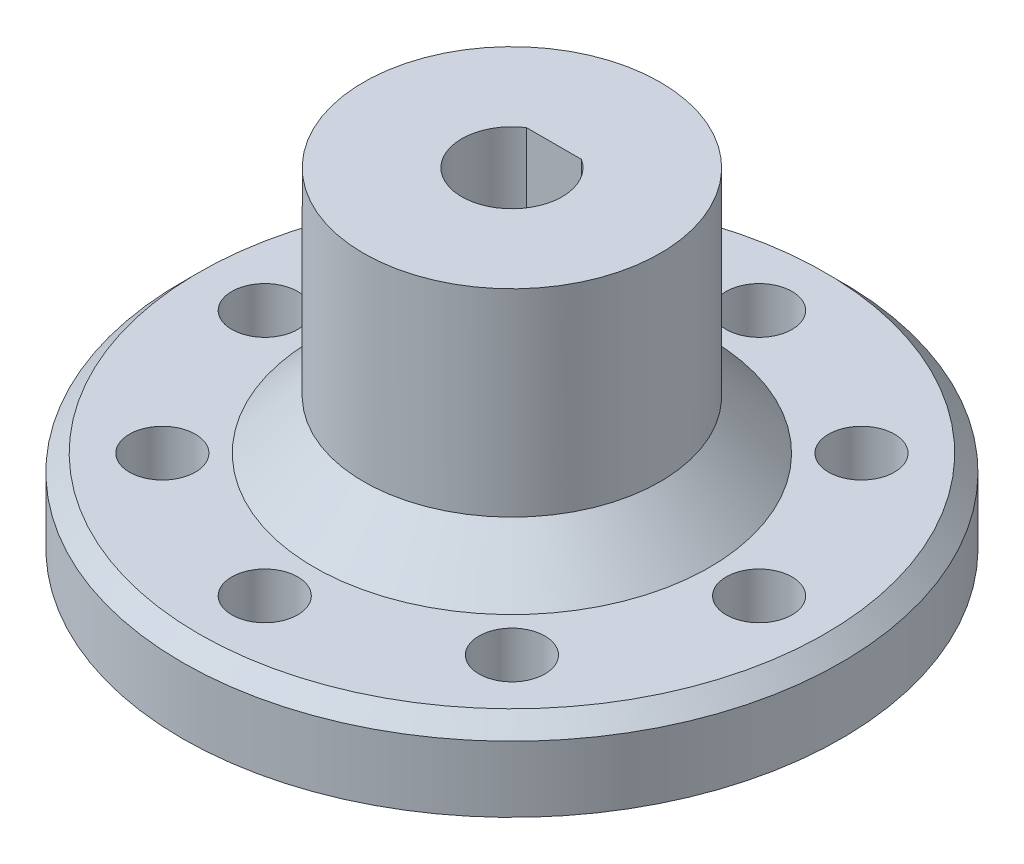
ISO-10303-21;
HEADER;
FILE_DESCRIPTION(('STEP AP214'),'2;1');
FILE_NAME('part.step','',(''),(''),'','','');
FILE_SCHEMA(('AUTOMOTIVE_DESIGN { 1 0 10303 214 1 1 1 1 }'));
ENDSEC;
DATA;
#1=APPLICATION_CONTEXT('core data for automotive mechanical design processes');
#2=APPLICATION_PROTOCOL_DEFINITION('international standard','automotive_design',2000,#1);
#3=PRODUCT_CONTEXT('',#1,'mechanical');
#4=PRODUCT('Part','Part','',(#3));
#5=PRODUCT_RELATED_PRODUCT_CATEGORY('part','',(#4));
#6=PRODUCT_DEFINITION_FORMATION('','',#4);
#7=PRODUCT_DEFINITION_CONTEXT('part definition',#1,'design');
#8=PRODUCT_DEFINITION('design','',#6,#7);
#9=PRODUCT_DEFINITION_SHAPE('','',#8);
#10=(LENGTH_UNIT() NAMED_UNIT(*) SI_UNIT(.MILLI.,.METRE.));
#11=(NAMED_UNIT(*) PLANE_ANGLE_UNIT() SI_UNIT($,.RADIAN.));
#12=(NAMED_UNIT(*) SI_UNIT($,.STERADIAN.) SOLID_ANGLE_UNIT());
#13=UNCERTAINTY_MEASURE_WITH_UNIT(LENGTH_MEASURE(1.E-05),#10,'distance_accuracy_value','');
#14=(GEOMETRIC_REPRESENTATION_CONTEXT(3) GLOBAL_UNCERTAINTY_ASSIGNED_CONTEXT((#13)) GLOBAL_UNIT_ASSIGNED_CONTEXT((#10,
#11,#12)) REPRESENTATION_CONTEXT('',''));
#15=CARTESIAN_POINT('',(0.,0.,0.));
#16=DIRECTION('',(0.,0.,1.));
#17=DIRECTION('',(1.,0.,0.));
#18=AXIS2_PLACEMENT_3D('',#15,#16,#17);
#19=CARTESIAN_POINT('',(0.,0.,-2.55));
#20=DIRECTION('',(0.,0.,1.));
#21=DIRECTION('',(1.,0.,0.));
#22=AXIS2_PLACEMENT_3D('',#19,#20,#21);
#23=PLANE('',#22);
#24=CARTESIAN_POINT('',(0.,14.,-2.55));
#25=DIRECTION('',(0.,0.,1.));
#26=DIRECTION('',(1.,0.,0.));
#27=AXIS2_PLACEMENT_3D('',#24,#25,#26);
#28=CIRCLE('',#27,1.75);
#29=CARTESIAN_POINT('',(-1.67332005306815,14.512347538298,-2.55));
#30=VERTEX_POINT('',#29);
#31=CARTESIAN_POINT('',(1.67332005306815,14.512347538298,-2.55));
#32=VERTEX_POINT('',#31);
#33=EDGE_CURVE('E150',#30,#32,#28,.F.);
#34=ORIENTED_EDGE('',*,*,#33,.T.);
#35=DIRECTION('',(0.,1.,0.));
#36=VECTOR('',#35,1.);
#37=CARTESIAN_POINT('',(1.67332005306815,0.,-2.55));
#38=LINE('',#37,#36);
#39=CARTESIAN_POINT('',(1.67332005306815,20.,-2.55));
#40=VERTEX_POINT('',#39);
#41=EDGE_CURVE('E161',#32,#40,#38,.T.);
#42=ORIENTED_EDGE('',*,*,#41,.T.);
#43=DIRECTION('',(1.,0.,0.));
#44=VECTOR('',#43,1.);
#45=CARTESIAN_POINT('',(0.,20.,-2.55));
#46=LINE('',#45,#44);
#47=CARTESIAN_POINT('',(-1.67332005306815,20.,-2.55));
#48=VERTEX_POINT('',#47);
#49=EDGE_CURVE('E287',#48,#40,#46,.T.);
#50=ORIENTED_EDGE('',*,*,#49,.F.);
#51=DIRECTION('',(0.,1.,0.));
#52=VECTOR('',#51,1.);
#53=CARTESIAN_POINT('',(-1.67332005306815,0.,-2.55));
#54=LINE('',#53,#52);
#55=EDGE_CURVE('E163',#30,#48,#54,.T.);
#56=ORIENTED_EDGE('',*,*,#55,.F.);
#57=EDGE_LOOP('',(#34,#42,#50,#56));
#58=FACE_BOUND('',#57,.T.);
#59=ADVANCED_FACE('F71',(#58),#23,.T.);
#60=CARTESIAN_POINT('',(0.,5.,0.));
#61=DIRECTION('',(0.,-1.,0.));
#62=DIRECTION('',(0.,0.,-1.));
#63=AXIS2_PLACEMENT_3D('',#60,#61,#62);
#64=CYLINDRICAL_SURFACE('',#63,20.);
#65=CARTESIAN_POINT('',(0.,4.00000000000001,0.));
#66=DIRECTION('',(0.,1.,0.));
#67=DIRECTION('',(0.,0.,1.));
#68=AXIS2_PLACEMENT_3D('',#65,#66,#67);
#69=CIRCLE('',#68,20.);
#70=CARTESIAN_POINT('',(0.,4.00000000000001,20.));
#71=VERTEX_POINT('',#70);
#72=EDGE_CURVE('E242',#71,#71,#69,.F.);
#73=ORIENTED_EDGE('',*,*,#72,.T.);
#74=EDGE_LOOP('',(#73));
#75=FACE_BOUND('',#74,.T.);
#76=CARTESIAN_POINT('',(0.,0.,0.));
#77=DIRECTION('',(0.,1.,0.));
#78=DIRECTION('',(0.,0.,1.));
#79=AXIS2_PLACEMENT_3D('',#76,#77,#78);
#80=CIRCLE('',#79,20.);
#81=CARTESIAN_POINT('',(0.,0.,20.));
#82=VERTEX_POINT('',#81);
#83=EDGE_CURVE('E186',#82,#82,#80,.T.);
#84=ORIENTED_EDGE('',*,*,#83,.T.);
#85=EDGE_LOOP('',(#84));
#86=FACE_BOUND('',#85,.T.);
#87=ADVANCED_FACE('F306',(#75,#86),#64,.T.);
#88=CARTESIAN_POINT('',(0.,5.,0.));
#89=DIRECTION('',(0.,1.,0.));
#90=DIRECTION('',(0.,0.,1.));
#91=AXIS2_PLACEMENT_3D('',#88,#89,#90);
#92=PLANE('',#91);
#93=CARTESIAN_POINT('',(0.,5.,0.));
#94=DIRECTION('',(0.,1.,0.));
#95=DIRECTION('',(0.,0.,1.));
#96=AXIS2_PLACEMENT_3D('',#93,#94,#95);
#97=CIRCLE('',#96,19.);
#98=CARTESIAN_POINT('',(0.,5.,19.));
#99=VERTEX_POINT('',#98);
#100=EDGE_CURVE('E239',#99,#99,#97,.T.);
#101=ORIENTED_EDGE('',*,*,#100,.T.);
#102=EDGE_LOOP('',(#101));
#103=FACE_BOUND('',#102,.T.);
#104=CARTESIAN_POINT('',(0.,5.,0.));
#105=DIRECTION('',(0.,1.,0.));
#106=DIRECTION('',(0.,0.,1.));
#107=AXIS2_PLACEMENT_3D('',#104,#105,#106);
#108=CIRCLE('',#107,12.);
#109=CARTESIAN_POINT('',(0.,5.,-12.));
#110=VERTEX_POINT('',#109);
#111=EDGE_CURVE('E236',#110,#110,#108,.F.);
#112=ORIENTED_EDGE('',*,*,#111,.T.);
#113=EDGE_LOOP('',(#112));
#114=FACE_BOUND('',#113,.T.);
#115=CARTESIAN_POINT('',(0.,5.,-15.));
#116=DIRECTION('',(0.,1.,0.));
#117=DIRECTION('',(0.,0.,1.));
#118=AXIS2_PLACEMENT_3D('',#115,#116,#117);
#119=CIRCLE('',#118,2.);
#120=CARTESIAN_POINT('',(0.,5.,-13.));
#121=VERTEX_POINT('',#120);
#122=EDGE_CURVE('E187',#121,#121,#119,.T.);
#123=ORIENTED_EDGE('',*,*,#122,.F.);
#124=EDGE_LOOP('',(#123));
#125=FACE_BOUND('',#124,.T.);
#126=CARTESIAN_POINT('',(10.6066017177982,5.,-10.6066017177982));
#127=DIRECTION('',(0.,1.,0.));
#128=DIRECTION('',(0.,0.,1.));
#129=AXIS2_PLACEMENT_3D('',#126,#127,#128);
#130=CIRCLE('',#129,2.);
#131=CARTESIAN_POINT('',(10.6066017177982,5.,-8.60660171779821));
#132=VERTEX_POINT('',#131);
#133=EDGE_CURVE('E193',#132,#132,#130,.T.);
#134=ORIENTED_EDGE('',*,*,#133,.F.);
#135=EDGE_LOOP('',(#134));
#136=FACE_BOUND('',#135,.T.);
#137=CARTESIAN_POINT('',(15.,5.,0.));
#138=DIRECTION('',(0.,1.,0.));
#139=DIRECTION('',(0.,0.,1.));
#140=AXIS2_PLACEMENT_3D('',#137,#138,#139);
#141=CIRCLE('',#140,2.);
#142=CARTESIAN_POINT('',(15.,5.,2.));
#143=VERTEX_POINT('',#142);
#144=EDGE_CURVE('E199',#143,#143,#141,.T.);
#145=ORIENTED_EDGE('',*,*,#144,.F.);
#146=EDGE_LOOP('',(#145));
#147=FACE_BOUND('',#146,.T.);
#148=CARTESIAN_POINT('',(10.6066017177982,5.,10.6066017177982));
#149=DIRECTION('',(0.,1.,0.));
#150=DIRECTION('',(0.,0.,1.));
#151=AXIS2_PLACEMENT_3D('',#148,#149,#150);
#152=CIRCLE('',#151,2.);
#153=CARTESIAN_POINT('',(10.6066017177982,5.,12.6066017177982));
#154=VERTEX_POINT('',#153);
#155=EDGE_CURVE('E205',#154,#154,#152,.T.);
#156=ORIENTED_EDGE('',*,*,#155,.F.);
#157=EDGE_LOOP('',(#156));
#158=FACE_BOUND('',#157,.T.);
#159=CARTESIAN_POINT('',(0.,5.,15.));
#160=DIRECTION('',(0.,1.,0.));
#161=DIRECTION('',(0.,0.,1.));
#162=AXIS2_PLACEMENT_3D('',#159,#160,#161);
#163=CIRCLE('',#162,2.);
#164=CARTESIAN_POINT('',(0.,5.,17.));
#165=VERTEX_POINT('',#164);
#166=EDGE_CURVE('E211',#165,#165,#163,.T.);
#167=ORIENTED_EDGE('',*,*,#166,.F.);
#168=EDGE_LOOP('',(#167));
#169=FACE_BOUND('',#168,.T.);
#170=CARTESIAN_POINT('',(-10.6066017177982,5.,10.6066017177982));
#171=DIRECTION('',(0.,1.,0.));
#172=DIRECTION('',(0.,0.,1.));
#173=AXIS2_PLACEMENT_3D('',#170,#171,#172);
#174=CIRCLE('',#173,2.);
#175=CARTESIAN_POINT('',(-10.6066017177982,5.,12.6066017177982));
#176=VERTEX_POINT('',#175);
#177=EDGE_CURVE('E217',#176,#176,#174,.T.);
#178=ORIENTED_EDGE('',*,*,#177,.F.);
#179=EDGE_LOOP('',(#178));
#180=FACE_BOUND('',#179,.T.);
#181=CARTESIAN_POINT('',(-15.,5.,0.));
#182=DIRECTION('',(0.,1.,0.));
#183=DIRECTION('',(0.,0.,1.));
#184=AXIS2_PLACEMENT_3D('',#181,#182,#183);
#185=CIRCLE('',#184,2.);
#186=CARTESIAN_POINT('',(-15.,5.,2.));
#187=VERTEX_POINT('',#186);
#188=EDGE_CURVE('E223',#187,#187,#185,.T.);
#189=ORIENTED_EDGE('',*,*,#188,.F.);
#190=EDGE_LOOP('',(#189));
#191=FACE_BOUND('',#190,.T.);
#192=CARTESIAN_POINT('',(-10.6066017177982,5.,-10.6066017177982));
#193=DIRECTION('',(0.,1.,0.));
#194=DIRECTION('',(0.,0.,1.));
#195=AXIS2_PLACEMENT_3D('',#192,#193,#194);
#196=CIRCLE('',#195,2.);
#197=CARTESIAN_POINT('',(-10.6066017177982,5.,-8.60660171779821));
#198=VERTEX_POINT('',#197);
#199=EDGE_CURVE('E182',#198,#198,#196,.T.);
#200=ORIENTED_EDGE('',*,*,#199,.F.);
#201=EDGE_LOOP('',(#200));
#202=FACE_BOUND('',#201,.T.);
#203=ADVANCED_FACE('F312',(#103,#114,#125,#136,#147,#158,#169,#180,#191,#202),#92,.T.);
#204=CARTESIAN_POINT('',(0.,0.,0.));
#205=DIRECTION('',(0.,1.,0.));
#206=DIRECTION('',(0.,0.,1.));
#207=AXIS2_PLACEMENT_3D('',#204,#205,#206);
#208=PLANE('',#207);
#209=DIRECTION('',(1.,0.,0.));
#210=VECTOR('',#209,1.);
#211=CARTESIAN_POINT('',(0.,0.,-2.55));
#212=LINE('',#211,#210);
#213=CARTESIAN_POINT('',(-1.67332005306815,0.,-2.55));
#214=VERTEX_POINT('',#213);
#215=CARTESIAN_POINT('',(1.67332005306815,0.,-2.55));
#216=VERTEX_POINT('',#215);
#217=EDGE_CURVE('E171',#214,#216,#212,.T.);
#218=ORIENTED_EDGE('',*,*,#217,.F.);
#219=CARTESIAN_POINT('',(0.,0.,0.));
#220=DIRECTION('',(0.,1.,0.));
#221=DIRECTION('',(0.,0.,1.));
#222=AXIS2_PLACEMENT_3D('',#219,#220,#221);
#223=CIRCLE('',#222,3.05);
#224=EDGE_CURVE('E173',#214,#216,#223,.T.);
#225=ORIENTED_EDGE('',*,*,#224,.T.);
#226=EDGE_LOOP('',(#218,#225));
#227=FACE_BOUND('',#226,.T.);
#228=CARTESIAN_POINT('',(0.,0.,-15.));
#229=DIRECTION('',(0.,1.,0.));
#230=DIRECTION('',(0.,0.,1.));
#231=AXIS2_PLACEMENT_3D('',#228,#229,#230);
#232=CIRCLE('',#231,2.);
#233=CARTESIAN_POINT('',(0.,0.,-13.));
#234=VERTEX_POINT('',#233);
#235=EDGE_CURVE('E183',#234,#234,#232,.T.);
#236=ORIENTED_EDGE('',*,*,#235,.T.);
#237=EDGE_LOOP('',(#236));
#238=FACE_BOUND('',#237,.T.);
#239=CARTESIAN_POINT('',(10.6066017177982,0.,-10.6066017177982));
#240=DIRECTION('',(0.,1.,0.));
#241=DIRECTION('',(0.,0.,1.));
#242=AXIS2_PLACEMENT_3D('',#239,#240,#241);
#243=CIRCLE('',#242,2.);
#244=CARTESIAN_POINT('',(10.6066017177982,0.,-8.60660171779821));
#245=VERTEX_POINT('',#244);
#246=EDGE_CURVE('E190',#245,#245,#243,.T.);
#247=ORIENTED_EDGE('',*,*,#246,.T.);
#248=EDGE_LOOP('',(#247));
#249=FACE_BOUND('',#248,.T.);
#250=CARTESIAN_POINT('',(15.,0.,0.));
#251=DIRECTION('',(0.,1.,0.));
#252=DIRECTION('',(0.,0.,1.));
#253=AXIS2_PLACEMENT_3D('',#250,#251,#252);
#254=CIRCLE('',#253,2.);
#255=CARTESIAN_POINT('',(15.,0.,2.));
#256=VERTEX_POINT('',#255);
#257=EDGE_CURVE('E196',#256,#256,#254,.T.);
#258=ORIENTED_EDGE('',*,*,#257,.T.);
#259=EDGE_LOOP('',(#258));
#260=FACE_BOUND('',#259,.T.);
#261=CARTESIAN_POINT('',(10.6066017177982,0.,10.6066017177982));
#262=DIRECTION('',(0.,1.,0.));
#263=DIRECTION('',(0.,0.,1.));
#264=AXIS2_PLACEMENT_3D('',#261,#262,#263);
#265=CIRCLE('',#264,2.);
#266=CARTESIAN_POINT('',(10.6066017177982,0.,12.6066017177982));
#267=VERTEX_POINT('',#266);
#268=EDGE_CURVE('E202',#267,#267,#265,.T.);
#269=ORIENTED_EDGE('',*,*,#268,.T.);
#270=EDGE_LOOP('',(#269));
#271=FACE_BOUND('',#270,.T.);
#272=CARTESIAN_POINT('',(0.,0.,15.));
#273=DIRECTION('',(0.,1.,0.));
#274=DIRECTION('',(0.,0.,1.));
#275=AXIS2_PLACEMENT_3D('',#272,#273,#274);
#276=CIRCLE('',#275,2.);
#277=CARTESIAN_POINT('',(0.,0.,17.));
#278=VERTEX_POINT('',#277);
#279=EDGE_CURVE('E208',#278,#278,#276,.T.);
#280=ORIENTED_EDGE('',*,*,#279,.T.);
#281=EDGE_LOOP('',(#280));
#282=FACE_BOUND('',#281,.T.);
#283=CARTESIAN_POINT('',(-10.6066017177982,0.,10.6066017177982));
#284=DIRECTION('',(0.,1.,0.));
#285=DIRECTION('',(0.,0.,1.));
#286=AXIS2_PLACEMENT_3D('',#283,#284,#285);
#287=CIRCLE('',#286,2.);
#288=CARTESIAN_POINT('',(-10.6066017177982,0.,12.6066017177982));
#289=VERTEX_POINT('',#288);
#290=EDGE_CURVE('E214',#289,#289,#287,.T.);
#291=ORIENTED_EDGE('',*,*,#290,.T.);
#292=EDGE_LOOP('',(#291));
#293=FACE_BOUND('',#292,.T.);
#294=CARTESIAN_POINT('',(-15.,0.,0.));
#295=DIRECTION('',(0.,1.,0.));
#296=DIRECTION('',(0.,0.,1.));
#297=AXIS2_PLACEMENT_3D('',#294,#295,#296);
#298=CIRCLE('',#297,2.);
#299=CARTESIAN_POINT('',(-15.,0.,2.));
#300=VERTEX_POINT('',#299);
#301=EDGE_CURVE('E220',#300,#300,#298,.T.);
#302=ORIENTED_EDGE('',*,*,#301,.T.);
#303=EDGE_LOOP('',(#302));
#304=FACE_BOUND('',#303,.T.);
#305=CARTESIAN_POINT('',(-10.6066017177982,0.,-10.6066017177982));
#306=DIRECTION('',(0.,1.,0.));
#307=DIRECTION('',(0.,0.,1.));
#308=AXIS2_PLACEMENT_3D('',#305,#306,#307);
#309=CIRCLE('',#308,2.);
#310=CARTESIAN_POINT('',(-10.6066017177982,0.,-8.60660171779821));
#311=VERTEX_POINT('',#310);
#312=EDGE_CURVE('E226',#311,#311,#309,.T.);
#313=ORIENTED_EDGE('',*,*,#312,.T.);
#314=EDGE_LOOP('',(#313));
#315=FACE_BOUND('',#314,.T.);
#316=ORIENTED_EDGE('',*,*,#83,.F.);
#317=EDGE_LOOP('',(#316));
#318=FACE_BOUND('',#317,.T.);
#319=ADVANCED_FACE('F329',(#227,#238,#249,#260,#271,#282,#293,#304,#315,#318),#208,.F.);
#320=CARTESIAN_POINT('',(-10.6066017177982,0.,-10.6066017177982));
#321=DIRECTION('',(0.,1.,0.));
#322=DIRECTION('',(0.,0.,1.));
#323=AXIS2_PLACEMENT_3D('',#320,#321,#322);
#324=CYLINDRICAL_SURFACE('',#323,2.);
#325=ORIENTED_EDGE('',*,*,#312,.F.);
#326=EDGE_LOOP('',(#325));
#327=FACE_BOUND('',#326,.T.);
#328=ORIENTED_EDGE('',*,*,#199,.T.);
#329=EDGE_LOOP('',(#328));
#330=FACE_BOUND('',#329,.T.);
#331=ADVANCED_FACE('F332',(#327,#330),#324,.F.);
#332=CARTESIAN_POINT('',(-15.,0.,0.));
#333=DIRECTION('',(0.,1.,0.));
#334=DIRECTION('',(0.,0.,1.));
#335=AXIS2_PLACEMENT_3D('',#332,#333,#334);
#336=CYLINDRICAL_SURFACE('',#335,2.);
#337=ORIENTED_EDGE('',*,*,#301,.F.);
#338=EDGE_LOOP('',(#337));
#339=FACE_BOUND('',#338,.T.);
#340=ORIENTED_EDGE('',*,*,#188,.T.);
#341=EDGE_LOOP('',(#340));
#342=FACE_BOUND('',#341,.T.);
#343=ADVANCED_FACE('F355',(#339,#342),#336,.F.);
#344=CARTESIAN_POINT('',(-10.6066017177982,0.,10.6066017177982));
#345=DIRECTION('',(0.,1.,0.));
#346=DIRECTION('',(0.,0.,1.));
#347=AXIS2_PLACEMENT_3D('',#344,#345,#346);
#348=CYLINDRICAL_SURFACE('',#347,2.);
#349=ORIENTED_EDGE('',*,*,#290,.F.);
#350=EDGE_LOOP('',(#349));
#351=FACE_BOUND('',#350,.T.);
#352=ORIENTED_EDGE('',*,*,#177,.T.);
#353=EDGE_LOOP('',(#352));
#354=FACE_BOUND('',#353,.T.);
#355=ADVANCED_FACE('F369',(#351,#354),#348,.F.);
#356=CARTESIAN_POINT('',(0.,0.,15.));
#357=DIRECTION('',(0.,1.,0.));
#358=DIRECTION('',(0.,0.,1.));
#359=AXIS2_PLACEMENT_3D('',#356,#357,#358);
#360=CYLINDRICAL_SURFACE('',#359,2.);
#361=ORIENTED_EDGE('',*,*,#279,.F.);
#362=EDGE_LOOP('',(#361));
#363=FACE_BOUND('',#362,.T.);
#364=ORIENTED_EDGE('',*,*,#166,.T.);
#365=EDGE_LOOP('',(#364));
#366=FACE_BOUND('',#365,.T.);
#367=ADVANCED_FACE('F373',(#363,#366),#360,.F.);
#368=CARTESIAN_POINT('',(10.6066017177982,0.,10.6066017177982));
#369=DIRECTION('',(0.,1.,0.));
#370=DIRECTION('',(0.,0.,1.));
#371=AXIS2_PLACEMENT_3D('',#368,#369,#370);
#372=CYLINDRICAL_SURFACE('',#371,2.);
#373=ORIENTED_EDGE('',*,*,#268,.F.);
#374=EDGE_LOOP('',(#373));
#375=FACE_BOUND('',#374,.T.);
#376=ORIENTED_EDGE('',*,*,#155,.T.);
#377=EDGE_LOOP('',(#376));
#378=FACE_BOUND('',#377,.T.);
#379=ADVANCED_FACE('F377',(#375,#378),#372,.F.);
#380=CARTESIAN_POINT('',(15.,0.,0.));
#381=DIRECTION('',(0.,1.,0.));
#382=DIRECTION('',(0.,0.,1.));
#383=AXIS2_PLACEMENT_3D('',#380,#381,#382);
#384=CYLINDRICAL_SURFACE('',#383,2.);
#385=ORIENTED_EDGE('',*,*,#257,.F.);
#386=EDGE_LOOP('',(#385));
#387=FACE_BOUND('',#386,.T.);
#388=ORIENTED_EDGE('',*,*,#144,.T.);
#389=EDGE_LOOP('',(#388));
#390=FACE_BOUND('',#389,.T.);
#391=ADVANCED_FACE('F381',(#387,#390),#384,.F.);
#392=CARTESIAN_POINT('',(10.6066017177982,0.,-10.6066017177982));
#393=DIRECTION('',(0.,1.,0.));
#394=DIRECTION('',(0.,0.,1.));
#395=AXIS2_PLACEMENT_3D('',#392,#393,#394);
#396=CYLINDRICAL_SURFACE('',#395,2.);
#397=ORIENTED_EDGE('',*,*,#246,.F.);
#398=EDGE_LOOP('',(#397));
#399=FACE_BOUND('',#398,.T.);
#400=ORIENTED_EDGE('',*,*,#133,.T.);
#401=EDGE_LOOP('',(#400));
#402=FACE_BOUND('',#401,.T.);
#403=ADVANCED_FACE('F303',(#399,#402),#396,.F.);
#404=CARTESIAN_POINT('',(0.,0.,-15.));
#405=DIRECTION('',(0.,1.,0.));
#406=DIRECTION('',(0.,0.,1.));
#407=AXIS2_PLACEMENT_3D('',#404,#405,#406);
#408=CYLINDRICAL_SURFACE('',#407,2.);
#409=ORIENTED_EDGE('',*,*,#235,.F.);
#410=EDGE_LOOP('',(#409));
#411=FACE_BOUND('',#410,.T.);
#412=ORIENTED_EDGE('',*,*,#122,.T.);
#413=EDGE_LOOP('',(#412));
#414=FACE_BOUND('',#413,.T.);
#415=ADVANCED_FACE('F297',(#411,#414),#408,.F.);
#416=CARTESIAN_POINT('',(0.,20.,0.));
#417=DIRECTION('',(0.,-1.,0.));
#418=DIRECTION('',(0.,0.,-1.));
#419=AXIS2_PLACEMENT_3D('',#416,#417,#418);
#420=CYLINDRICAL_SURFACE('',#419,9.);
#421=CARTESIAN_POINT('',(0.,22.4,0.));
#422=DIRECTION('',(0.866025403784439,0.5,0.));
#423=DIRECTION('',(0.5,-0.866025403784439,0.));
#424=AXIS2_PLACEMENT_3D('',#421,#422,#423);
#425=ELLIPSE('',#424,18.,9.);
#426=CARTESIAN_POINT('',(4.84974226119286,14.,-7.58155656840994));
#427=VERTEX_POINT('',#426);
#428=CARTESIAN_POINT('',(2.42487113059643,18.2,-8.66717947200818));
#429=VERTEX_POINT('',#428);
#430=EDGE_CURVE('E79',#427,#429,#425,.T.);
#431=ORIENTED_EDGE('',*,*,#430,.T.);
#432=CARTESIAN_POINT('',(0.,18.2,0.));
#433=DIRECTION('',(0.,1.,0.));
#434=DIRECTION('',(0.,0.,1.));
#435=AXIS2_PLACEMENT_3D('',#432,#433,#434);
#436=CIRCLE('',#435,9.);
#437=CARTESIAN_POINT('',(-2.42487113059643,18.2,-8.66717947200818));
#438=VERTEX_POINT('',#437);
#439=EDGE_CURVE('E12',#429,#438,#436,.T.);
#440=ORIENTED_EDGE('',*,*,#439,.T.);
#441=CARTESIAN_POINT('',(0.,22.4,0.));
#442=DIRECTION('',(-0.866025403784439,0.5,0.));
#443=DIRECTION('',(-0.5,-0.866025403784439,0.));
#444=AXIS2_PLACEMENT_3D('',#441,#442,#443);
#445=ELLIPSE('',#444,18.,9.);
#446=CARTESIAN_POINT('',(-4.84974226119286,14.,-7.58155656840995));
#447=VERTEX_POINT('',#446);
#448=EDGE_CURVE('E245',#438,#447,#445,.T.);
#449=ORIENTED_EDGE('',*,*,#448,.T.);
#450=CARTESIAN_POINT('',(0.,5.6,0.));
#451=DIRECTION('',(-0.866025403784439,-0.5,0.));
#452=DIRECTION('',(0.5,-0.866025403784439,0.));
#453=AXIS2_PLACEMENT_3D('',#450,#451,#452);
#454=ELLIPSE('',#453,18.,9.);
#455=CARTESIAN_POINT('',(-2.42487113059643,9.8,-8.66717947200818));
#456=VERTEX_POINT('',#455);
#457=EDGE_CURVE('E248',#447,#456,#454,.T.);
#458=ORIENTED_EDGE('',*,*,#457,.T.);
#459=CARTESIAN_POINT('',(0.,9.8,0.));
#460=DIRECTION('',(0.,-1.,0.));
#461=DIRECTION('',(0.,0.,-1.));
#462=AXIS2_PLACEMENT_3D('',#459,#460,#461);
#463=CIRCLE('',#462,9.);
#464=CARTESIAN_POINT('',(2.42487113059643,9.8,-8.66717947200818));
#465=VERTEX_POINT('',#464);
#466=EDGE_CURVE('E251',#456,#465,#463,.T.);
#467=ORIENTED_EDGE('',*,*,#466,.T.);
#468=CARTESIAN_POINT('',(0.,5.59999999999999,0.));
#469=DIRECTION('',(0.866025403784439,-0.5,0.));
#470=DIRECTION('',(-0.5,-0.866025403784439,0.));
#471=AXIS2_PLACEMENT_3D('',#468,#469,#470);
#472=ELLIPSE('',#471,18.,9.);
#473=EDGE_CURVE('E253',#465,#427,#472,.T.);
#474=ORIENTED_EDGE('',*,*,#473,.T.);
#475=EDGE_LOOP('',(#431,#440,#449,#458,#467,#474));
#476=FACE_BOUND('',#475,.T.);
#477=CARTESIAN_POINT('',(0.,8.00000000000001,0.));
#478=DIRECTION('',(0.,1.,0.));
#479=DIRECTION('',(0.,0.,1.));
#480=AXIS2_PLACEMENT_3D('',#477,#478,#479);
#481=CIRCLE('',#480,9.);
#482=CARTESIAN_POINT('',(0.,8.00000000000001,-9.));
#483=VERTEX_POINT('',#482);
#484=EDGE_CURVE('E233',#483,#483,#481,.T.);
#485=ORIENTED_EDGE('',*,*,#484,.T.);
#486=EDGE_LOOP('',(#485));
#487=FACE_BOUND('',#486,.T.);
#488=CARTESIAN_POINT('',(0.,20.,0.));
#489=DIRECTION('',(0.,1.,0.));
#490=DIRECTION('',(0.,0.,1.));
#491=AXIS2_PLACEMENT_3D('',#488,#489,#490);
#492=CIRCLE('',#491,9.);
#493=CARTESIAN_POINT('',(0.,20.,9.));
#494=VERTEX_POINT('',#493);
#495=EDGE_CURVE('E179',#494,#494,#492,.T.);
#496=ORIENTED_EDGE('',*,*,#495,.F.);
#497=EDGE_LOOP('',(#496));
#498=FACE_BOUND('',#497,.T.);
#499=ADVANCED_FACE('F257',(#476,#487,#498),#420,.T.);
#500=CARTESIAN_POINT('',(0.,20.,0.));
#501=DIRECTION('',(0.,1.,0.));
#502=DIRECTION('',(0.,0.,1.));
#503=AXIS2_PLACEMENT_3D('',#500,#501,#502);
#504=PLANE('',#503);
#505=CARTESIAN_POINT('',(0.,20.,0.));
#506=DIRECTION('',(0.,1.,0.));
#507=DIRECTION('',(0.,0.,1.));
#508=AXIS2_PLACEMENT_3D('',#505,#506,#507);
#509=CIRCLE('',#508,3.05);
#510=EDGE_CURVE('E168',#48,#40,#509,.T.);
#511=ORIENTED_EDGE('',*,*,#510,.F.);
#512=ORIENTED_EDGE('',*,*,#49,.T.);
#513=EDGE_LOOP('',(#511,#512));
#514=FACE_BOUND('',#513,.T.);
#515=ORIENTED_EDGE('',*,*,#495,.T.);
#516=EDGE_LOOP('',(#515));
#517=FACE_BOUND('',#516,.T.);
#518=ADVANCED_FACE('F290',(#514,#517),#504,.T.);
#519=CARTESIAN_POINT('',(0.,0.,0.));
#520=DIRECTION('',(0.,1.,0.));
#521=DIRECTION('',(0.,0.,1.));
#522=AXIS2_PLACEMENT_3D('',#519,#520,#521);
#523=CYLINDRICAL_SURFACE('',#522,3.05);
#524=ORIENTED_EDGE('',*,*,#41,.F.);
#525=CARTESIAN_POINT('',(1.67332005306815,13.487652461702,-2.55));
#526=CARTESIAN_POINT('',(1.68553541611033,13.5275537150235,-2.54198152756054));
#527=CARTESIAN_POINT('',(1.69636466396522,13.5680214760193,-2.53475326877177));
#528=CARTESIAN_POINT('',(1.71514148809875,13.6499134497087,-2.5220862379416));
#529=CARTESIAN_POINT('',(1.72308768491606,13.6913381101965,-2.51664832264565));
#530=CARTESIAN_POINT('',(1.74202463836305,13.8141486873373,-2.50361776497167));
#531=CARTESIAN_POINT('',(1.74887528238923,13.8965567124732,-2.49879155563403));
#532=CARTESIAN_POINT('',(1.75041426372599,14.0235984738203,-2.49770657970718));
#533=CARTESIAN_POINT('',(1.74923861117457,14.0682293256301,-2.49853439307472));
#534=CARTESIAN_POINT('',(1.74349416155385,14.1571986555166,-2.50254726869512));
#535=CARTESIAN_POINT('',(1.73892391231662,14.2015370002702,-2.50573333978044));
#536=CARTESIAN_POINT('',(1.72625018163319,14.2909776738836,-2.51448265725698));
#537=CARTESIAN_POINT('',(1.71803432041521,14.3360564185276,-2.5201213904749));
#538=CARTESIAN_POINT('',(1.69819602263748,14.4251073195312,-2.5335278114452));
#539=CARTESIAN_POINT('',(1.686575699335,14.4690801440391,-2.54129417831452));
#540=CARTESIAN_POINT('',(1.67332005306815,14.512347538298,-2.55));
#541=B_SPLINE_CURVE_WITH_KNOTS('',3,(#525,#526,#527,#528,#529,#530,#531,#532,#533,#534,#535,
#536,#537,#538,#539,#540),.UNSPECIFIED.,.F.,.F.,(4,2,2,2,2,2,2,4),(0.,0.127406255011993,
0.254873390301335,0.501952998698892,0.635757097710008,0.769618469507444,0.907928762863684,
1.04615338389152),.UNSPECIFIED.);
#542=CARTESIAN_POINT('',(1.67332005306815,13.487652461702,-2.55));
#543=VERTEX_POINT('',#542);
#544=EDGE_CURVE('E146',#543,#32,#541,.T.);
#545=ORIENTED_EDGE('',*,*,#544,.F.);
#546=EDGE_CURVE('E170',#216,#543,#38,.T.);
#547=ORIENTED_EDGE('',*,*,#546,.F.);
#548=ORIENTED_EDGE('',*,*,#224,.F.);
#549=CARTESIAN_POINT('',(-1.67332005306815,13.487652461702,-2.55));
#550=VERTEX_POINT('',#549);
#551=EDGE_CURVE('E177',#214,#550,#54,.T.);
#552=ORIENTED_EDGE('',*,*,#551,.T.);
#553=CARTESIAN_POINT('',(-1.67332005306815,14.512347538298,-2.55));
#554=CARTESIAN_POINT('',(-1.68553541611033,14.4724462849765,-2.54198152756054));
#555=CARTESIAN_POINT('',(-1.69636466396522,14.4319785239807,-2.53475326877177));
#556=CARTESIAN_POINT('',(-1.71514148809875,14.3500865502913,-2.5220862379416));
#557=CARTESIAN_POINT('',(-1.72308768491606,14.3086618898035,-2.51664832264565));
#558=CARTESIAN_POINT('',(-1.74202463836305,14.1858513126627,-2.50361776497167));
#559=CARTESIAN_POINT('',(-1.74887528238923,14.1034432875268,-2.49879155563403));
#560=CARTESIAN_POINT('',(-1.75041426372599,13.9764015261797,-2.49770657970718));
#561=CARTESIAN_POINT('',(-1.74923861117457,13.9317706743699,-2.49853439307472));
#562=CARTESIAN_POINT('',(-1.74349416155385,13.8428013444834,-2.50254726869512));
#563=CARTESIAN_POINT('',(-1.73892391231662,13.7984629997298,-2.50573333978044));
#564=CARTESIAN_POINT('',(-1.72625018163319,13.7090223261164,-2.51448265725698));
#565=CARTESIAN_POINT('',(-1.71803432041521,13.6639435814724,-2.5201213904749));
#566=CARTESIAN_POINT('',(-1.69819602263748,13.5748926804688,-2.5335278114452));
#567=CARTESIAN_POINT('',(-1.686575699335,13.5309198559609,-2.54129417831452));
#568=CARTESIAN_POINT('',(-1.67332005306815,13.487652461702,-2.55));
#569=B_SPLINE_CURVE_WITH_KNOTS('',3,(#553,#554,#555,#556,#557,#558,#559,#560,#561,#562,#563,
#564,#565,#566,#567,#568),.UNSPECIFIED.,.F.,.F.,(4,2,2,2,2,2,2,4),(0.,0.127406255011993,
0.254873390301335,0.501952998698892,0.635757097710009,0.769618469507444,0.907928762863684,
1.04615338389152),.UNSPECIFIED.);
#570=EDGE_CURVE('E86',#30,#550,#569,.T.);
#571=ORIENTED_EDGE('',*,*,#570,.F.);
#572=ORIENTED_EDGE('',*,*,#55,.T.);
#573=ORIENTED_EDGE('',*,*,#510,.T.);
#574=EDGE_LOOP('',(#524,#545,#547,#548,#552,#571,#572,#573));
#575=FACE_BOUND('',#574,.T.);
#576=ADVANCED_FACE('F166',(#575),#523,.F.);
#577=EDGE_CURVE('E151',#543,#550,#28,.F.);
#578=ORIENTED_EDGE('',*,*,#577,.T.);
#579=ORIENTED_EDGE('',*,*,#551,.F.);
#580=ORIENTED_EDGE('',*,*,#217,.T.);
#581=ORIENTED_EDGE('',*,*,#546,.T.);
#582=EDGE_LOOP('',(#578,#579,#580,#581));
#583=FACE_BOUND('',#582,.T.);
#584=ADVANCED_FACE('F308',(#583),#23,.T.);
#585=CARTESIAN_POINT('',(0.,8.00000000000001,0.));
#586=DIRECTION('',(0.,-1.,0.));
#587=DIRECTION('',(0.,0.,-1.));
#588=AXIS2_PLACEMENT_3D('',#585,#586,#587);
#589=CONICAL_SURFACE('',#588,9.,0.785398163397449);
#590=CARTESIAN_POINT('',(0.,5.,-12.));
#591=CARTESIAN_POINT('',(0.,5.03125,-11.96875));
#592=CARTESIAN_POINT('',(0.,5.0625,-11.9375));
#593=CARTESIAN_POINT('',(0.,5.125,-11.875));
#594=CARTESIAN_POINT('',(0.,5.15625,-11.84375));
#595=CARTESIAN_POINT('',(0.,5.21875,-11.78125));
#596=CARTESIAN_POINT('',(0.,5.25,-11.75));
#597=CARTESIAN_POINT('',(0.,5.3125,-11.6875));
#598=CARTESIAN_POINT('',(0.,5.34375,-11.65625));
#599=CARTESIAN_POINT('',(0.,5.40625,-11.59375));
#600=CARTESIAN_POINT('',(0.,5.4375,-11.5625));
#601=CARTESIAN_POINT('',(0.,5.5,-11.5));
#602=CARTESIAN_POINT('',(0.,5.53125,-11.46875));
#603=CARTESIAN_POINT('',(0.,5.59375,-11.40625));
#604=CARTESIAN_POINT('',(0.,5.625,-11.375));
#605=CARTESIAN_POINT('',(0.,5.6875,-11.3125));
#606=CARTESIAN_POINT('',(0.,5.71875,-11.28125));
#607=CARTESIAN_POINT('',(0.,5.78125,-11.21875));
#608=CARTESIAN_POINT('',(0.,5.8125,-11.1875));
#609=CARTESIAN_POINT('',(0.,5.875,-11.125));
#610=CARTESIAN_POINT('',(0.,5.90625,-11.09375));
#611=CARTESIAN_POINT('',(0.,5.96875,-11.03125));
#612=CARTESIAN_POINT('',(0.,6.,-11.));
#613=CARTESIAN_POINT('',(0.,6.0625,-10.9375));
#614=CARTESIAN_POINT('',(0.,6.09375,-10.90625));
#615=CARTESIAN_POINT('',(0.,6.15625,-10.84375));
#616=CARTESIAN_POINT('',(0.,6.1875,-10.8125));
#617=CARTESIAN_POINT('',(0.,6.25,-10.75));
#618=CARTESIAN_POINT('',(0.,6.28125,-10.71875));
#619=CARTESIAN_POINT('',(0.,6.34375,-10.65625));
#620=CARTESIAN_POINT('',(0.,6.375,-10.625));
#621=CARTESIAN_POINT('',(0.,6.4375,-10.5625));
#622=CARTESIAN_POINT('',(0.,6.46875,-10.53125));
#623=CARTESIAN_POINT('',(0.,6.53125,-10.46875));
#624=CARTESIAN_POINT('',(0.,6.5625,-10.4375));
#625=CARTESIAN_POINT('',(0.,6.625,-10.375));
#626=CARTESIAN_POINT('',(0.,6.65625,-10.34375));
#627=CARTESIAN_POINT('',(0.,6.71875,-10.28125));
#628=CARTESIAN_POINT('',(0.,6.75,-10.25));
#629=CARTESIAN_POINT('',(0.,6.8125,-10.1875));
#630=CARTESIAN_POINT('',(0.,6.84375,-10.15625));
#631=CARTESIAN_POINT('',(0.,6.90625,-10.09375));
#632=CARTESIAN_POINT('',(0.,6.9375,-10.0625));
#633=CARTESIAN_POINT('',(0.,7.,-10.));
#634=CARTESIAN_POINT('',(0.,7.03125,-9.96875));
#635=CARTESIAN_POINT('',(0.,7.09375,-9.90625));
#636=CARTESIAN_POINT('',(0.,7.125,-9.875));
#637=CARTESIAN_POINT('',(0.,7.1875,-9.8125));
#638=CARTESIAN_POINT('',(0.,7.21875,-9.78125));
#639=CARTESIAN_POINT('',(0.,7.28125,-9.71875));
#640=CARTESIAN_POINT('',(0.,7.3125,-9.6875));
#641=CARTESIAN_POINT('',(0.,7.375,-9.625));
#642=CARTESIAN_POINT('',(0.,7.40625,-9.59375));
#643=CARTESIAN_POINT('',(0.,7.46875000000001,-9.53125));
#644=CARTESIAN_POINT('',(0.,7.50000000000001,-9.5));
#645=CARTESIAN_POINT('',(0.,7.56250000000001,-9.4375));
#646=CARTESIAN_POINT('',(0.,7.59375000000001,-9.40625));
#647=CARTESIAN_POINT('',(0.,7.65625000000001,-9.34375));
#648=CARTESIAN_POINT('',(0.,7.68750000000001,-9.3125));
#649=CARTESIAN_POINT('',(0.,7.75000000000001,-9.25));
#650=CARTESIAN_POINT('',(0.,7.78125000000001,-9.21875));
#651=CARTESIAN_POINT('',(0.,7.84375000000001,-9.15625));
#652=CARTESIAN_POINT('',(0.,7.87500000000001,-9.125));
#653=CARTESIAN_POINT('',(0.,7.93750000000001,-9.0625));
#654=CARTESIAN_POINT('',(0.,7.96875000000001,-9.03125));
#655=CARTESIAN_POINT('',(0.,8.00000000000001,-9.));
#656=B_SPLINE_CURVE_WITH_KNOTS('',3,(#590,#591,#592,#593,#594,#595,#596,#597,#598,#599,#600,
#601,#602,#603,#604,#605,#606,#607,#608,#609,#610,#611,#612,#613,#614,#615,#616,#617,#618,#619,
#620,#621,#622,#623,#624,#625,#626,#627,#628,#629,#630,#631,#632,#633,#634,#635,#636,#637,#638,
#639,#640,#641,#642,#643,#644,#645,#646,#647,#648,#649,#650,#651,#652,#653,#654,#655),
.UNSPECIFIED.,.F.,.F.,(4,2,2,2,2,2,2,2,2,2,2,2,2,2,2,2,2,2,2,2,2,2,2,2,2,2,2,2,2,2,2,2,4),(0.,
0.132582521472478,0.265165042944956,0.397747564417435,0.530330085889913,0.662912607362391,
0.795495128834869,0.928077650307347,1.06066017177982,1.1932426932523,1.32582521472478,
1.45840773619726,1.59099025766974,1.72357277914222,1.85615530061469,1.98873782208717,
2.12132034355965,2.25390286503213,2.38648538650461,2.51906790797708,2.65165042944956,
2.78423295092204,2.91681547239452,3.049397993867,3.18198051533947,3.31456303681195,
3.44714555828443,3.57972807975691,3.71231060122939,3.84489312270186,3.97747564417434,
4.11005816564682,4.2426406871193),.UNSPECIFIED.);
#657=EDGE_CURVE('BSEAM318',#110,#483,#656,.T.);
#658=ORIENTED_EDGE('',*,*,#111,.F.);
#659=ORIENTED_EDGE('',*,*,#484,.F.);
#660=ORIENTED_EDGE('',*,*,#657,.T.);
#661=ORIENTED_EDGE('',*,*,#657,.F.);
#662=EDGE_LOOP('',(#658,#660,#659,#661));
#663=FACE_BOUND('',#662,.T.);
#664=ADVANCED_FACE('F318',(#663),#589,.T.);
#665=CARTESIAN_POINT('',(0.,5.,0.));
#666=DIRECTION('',(0.,-1.,0.));
#667=DIRECTION('',(0.,0.,-1.));
#668=AXIS2_PLACEMENT_3D('',#665,#666,#667);
#669=CONICAL_SURFACE('',#668,19.,0.785398163397448);
#670=ORIENTED_EDGE('',*,*,#72,.F.);
#671=EDGE_LOOP('',(#670));
#672=FACE_BOUND('',#671,.T.);
#673=ORIENTED_EDGE('',*,*,#100,.F.);
#674=EDGE_LOOP('',(#673));
#675=FACE_BOUND('',#674,.T.);
#676=ADVANCED_FACE('F73',(#672,#675),#669,.T.);
#677=CARTESIAN_POINT('',(0.,18.2,-5.5));
#678=DIRECTION('',(0.,1.,0.));
#679=DIRECTION('',(0.,0.,1.));
#680=AXIS2_PLACEMENT_3D('',#677,#678,#679);
#681=PLANE('',#680);
#682=DIRECTION('',(0.,0.,-1.));
#683=VECTOR('',#682,1.);
#684=CARTESIAN_POINT('',(2.42487113059643,18.2,-5.5));
#685=LINE('',#684,#683);
#686=CARTESIAN_POINT('',(2.42487113059643,18.2,-5.5));
#687=VERTEX_POINT('',#686);
#688=EDGE_CURVE('E267',#687,#429,#685,.T.);
#689=ORIENTED_EDGE('',*,*,#688,.F.);
#690=DIRECTION('',(1.,0.,0.));
#691=VECTOR('',#690,1.);
#692=CARTESIAN_POINT('',(0.,18.2,-5.5));
#693=LINE('',#692,#691);
#694=CARTESIAN_POINT('',(-2.42487113059643,18.2,-5.5));
#695=VERTEX_POINT('',#694);
#696=EDGE_CURVE('E613',#695,#687,#693,.T.);
#697=ORIENTED_EDGE('',*,*,#696,.F.);
#698=DIRECTION('',(0.,0.,-1.));
#699=VECTOR('',#698,1.);
#700=CARTESIAN_POINT('',(-2.42487113059643,18.2,-5.5));
#701=LINE('',#700,#699);
#702=EDGE_CURVE('E278',#695,#438,#701,.T.);
#703=ORIENTED_EDGE('',*,*,#702,.T.);
#704=ORIENTED_EDGE('',*,*,#439,.F.);
#705=EDGE_LOOP('',(#689,#697,#703,#704));
#706=FACE_BOUND('',#705,.T.);
#707=ADVANCED_FACE('F489',(#706),#681,.F.);
#708=CARTESIAN_POINT('',(9.69948452238571,5.6,-5.5));
#709=DIRECTION('',(0.866025403784439,0.5,0.));
#710=DIRECTION('',(-0.5,0.866025403784439,0.));
#711=AXIS2_PLACEMENT_3D('',#708,#709,#710);
#712=PLANE('',#711);
#713=DIRECTION('',(0.,0.,-1.));
#714=VECTOR('',#713,1.);
#715=CARTESIAN_POINT('',(4.84974226119286,14.,-5.5));
#716=LINE('',#715,#714);
#717=CARTESIAN_POINT('',(4.84974226119286,14.,-5.5));
#718=VERTEX_POINT('',#717);
#719=EDGE_CURVE('E265',#718,#427,#716,.T.);
#720=ORIENTED_EDGE('',*,*,#719,.F.);
#721=DIRECTION('',(0.5,-0.866025403784439,0.));
#722=VECTOR('',#721,1.);
#723=CARTESIAN_POINT('',(9.69948452238571,5.6,-5.5));
#724=LINE('',#723,#722);
#725=EDGE_CURVE('E616',#687,#718,#724,.T.);
#726=ORIENTED_EDGE('',*,*,#725,.F.);
#727=ORIENTED_EDGE('',*,*,#688,.T.);
#728=ORIENTED_EDGE('',*,*,#430,.F.);
#729=EDGE_LOOP('',(#720,#726,#727,#728));
#730=FACE_BOUND('',#729,.T.);
#731=ADVANCED_FACE('F263',(#730),#712,.F.);
#732=CARTESIAN_POINT('',(-2.42487113059643,1.4,-5.5));
#733=DIRECTION('',(0.866025403784439,-0.5,0.));
#734=DIRECTION('',(0.5,0.866025403784439,0.));
#735=AXIS2_PLACEMENT_3D('',#732,#733,#734);
#736=PLANE('',#735);
#737=DIRECTION('',(0.,0.,-1.));
#738=VECTOR('',#737,1.);
#739=CARTESIAN_POINT('',(2.42487113059643,9.8,-5.5));
#740=LINE('',#739,#738);
#741=CARTESIAN_POINT('',(2.42487113059643,9.8,-5.5));
#742=VERTEX_POINT('',#741);
#743=EDGE_CURVE('E274',#742,#465,#740,.T.);
#744=ORIENTED_EDGE('',*,*,#743,.F.);
#745=DIRECTION('',(-0.5,-0.866025403784439,0.));
#746=VECTOR('',#745,1.);
#747=CARTESIAN_POINT('',(-2.42487113059643,1.4,-5.5));
#748=LINE('',#747,#746);
#749=EDGE_CURVE('E272',#718,#742,#748,.T.);
#750=ORIENTED_EDGE('',*,*,#749,.F.);
#751=ORIENTED_EDGE('',*,*,#719,.T.);
#752=ORIENTED_EDGE('',*,*,#473,.F.);
#753=EDGE_LOOP('',(#744,#750,#751,#752));
#754=FACE_BOUND('',#753,.T.);
#755=ADVANCED_FACE('F269',(#754),#736,.F.);
#756=CARTESIAN_POINT('',(0.,9.8,-5.5));
#757=DIRECTION('',(0.,-1.,0.));
#758=DIRECTION('',(0.,0.,-1.));
#759=AXIS2_PLACEMENT_3D('',#756,#757,#758);
#760=PLANE('',#759);
#761=ORIENTED_EDGE('',*,*,#466,.F.);
#762=DIRECTION('',(0.,0.,-1.));
#763=VECTOR('',#762,1.);
#764=CARTESIAN_POINT('',(-2.42487113059643,9.8,-5.5));
#765=LINE('',#764,#763);
#766=CARTESIAN_POINT('',(-2.42487113059643,9.8,-5.5));
#767=VERTEX_POINT('',#766);
#768=EDGE_CURVE('E276',#767,#456,#765,.T.);
#769=ORIENTED_EDGE('',*,*,#768,.F.);
#770=DIRECTION('',(-1.,0.,0.));
#771=VECTOR('',#770,1.);
#772=CARTESIAN_POINT('',(0.,9.8,-5.5));
#773=LINE('',#772,#771);
#774=EDGE_CURVE('E285',#742,#767,#773,.T.);
#775=ORIENTED_EDGE('',*,*,#774,.F.);
#776=ORIENTED_EDGE('',*,*,#743,.T.);
#777=EDGE_LOOP('',(#761,#769,#775,#776));
#778=FACE_BOUND('',#777,.T.);
#779=ADVANCED_FACE('F508',(#778),#760,.F.);
#780=CARTESIAN_POINT('',(2.42487113059643,1.4,-5.5));
#781=DIRECTION('',(-0.866025403784439,-0.5,0.));
#782=DIRECTION('',(0.5,-0.866025403784439,0.));
#783=AXIS2_PLACEMENT_3D('',#780,#781,#782);
#784=PLANE('',#783);
#785=DIRECTION('',(0.,0.,-1.));
#786=VECTOR('',#785,1.);
#787=CARTESIAN_POINT('',(-4.84974226119286,14.,-5.5));
#788=LINE('',#787,#786);
#789=CARTESIAN_POINT('',(-4.84974226119286,14.,-5.5));
#790=VERTEX_POINT('',#789);
#791=EDGE_CURVE('E94',#790,#447,#788,.T.);
#792=ORIENTED_EDGE('',*,*,#791,.F.);
#793=DIRECTION('',(-0.5,0.866025403784439,0.));
#794=VECTOR('',#793,1.);
#795=CARTESIAN_POINT('',(2.42487113059643,1.4,-5.5));
#796=LINE('',#795,#794);
#797=EDGE_CURVE('E156',#767,#790,#796,.T.);
#798=ORIENTED_EDGE('',*,*,#797,.F.);
#799=ORIENTED_EDGE('',*,*,#768,.T.);
#800=ORIENTED_EDGE('',*,*,#457,.F.);
#801=EDGE_LOOP('',(#792,#798,#799,#800));
#802=FACE_BOUND('',#801,.T.);
#803=ADVANCED_FACE('F515',(#802),#784,.F.);
#804=CARTESIAN_POINT('',(-9.69948452238571,5.6,-5.5));
#805=DIRECTION('',(-0.866025403784439,0.5,0.));
#806=DIRECTION('',(-0.5,-0.866025403784439,0.));
#807=AXIS2_PLACEMENT_3D('',#804,#805,#806);
#808=PLANE('',#807);
#809=ORIENTED_EDGE('',*,*,#702,.F.);
#810=DIRECTION('',(0.5,0.866025403784439,0.));
#811=VECTOR('',#810,1.);
#812=CARTESIAN_POINT('',(-9.69948452238571,5.6,-5.5));
#813=LINE('',#812,#811);
#814=EDGE_CURVE('E610',#790,#695,#813,.T.);
#815=ORIENTED_EDGE('',*,*,#814,.F.);
#816=ORIENTED_EDGE('',*,*,#791,.T.);
#817=ORIENTED_EDGE('',*,*,#448,.F.);
#818=EDGE_LOOP('',(#809,#815,#816,#817));
#819=FACE_BOUND('',#818,.T.);
#820=ADVANCED_FACE('F523',(#819),#808,.F.);
#821=CARTESIAN_POINT('',(0.,0.,-5.5));
#822=DIRECTION('',(0.,0.,-1.));
#823=DIRECTION('',(-1.,0.,0.));
#824=AXIS2_PLACEMENT_3D('',#821,#822,#823);
#825=PLANE('',#824);
#826=CARTESIAN_POINT('',(0.,14.,-5.5));
#827=DIRECTION('',(0.,0.,-1.));
#828=DIRECTION('',(-1.,0.,0.));
#829=AXIS2_PLACEMENT_3D('',#826,#827,#828);
#830=CIRCLE('',#829,1.75);
#831=CARTESIAN_POINT('',(-1.75,14.,-5.5));
#832=VERTEX_POINT('',#831);
#833=EDGE_CURVE('E164',#832,#832,#830,.F.);
#834=ORIENTED_EDGE('',*,*,#833,.T.);
#835=EDGE_LOOP('',(#834));
#836=FACE_BOUND('',#835,.T.);
#837=ORIENTED_EDGE('',*,*,#797,.T.);
#838=ORIENTED_EDGE('',*,*,#814,.T.);
#839=ORIENTED_EDGE('',*,*,#696,.T.);
#840=ORIENTED_EDGE('',*,*,#725,.T.);
#841=ORIENTED_EDGE('',*,*,#749,.T.);
#842=ORIENTED_EDGE('',*,*,#774,.T.);
#843=EDGE_LOOP('',(#837,#838,#839,#840,#841,#842));
#844=FACE_BOUND('',#843,.T.);
#845=ADVANCED_FACE('F530',(#836,#844),#825,.T.);
#846=CARTESIAN_POINT('',(0.,14.,20.001));
#847=DIRECTION('',(0.,0.,-1.));
#848=DIRECTION('',(-1.,0.,0.));
#849=AXIS2_PLACEMENT_3D('',#846,#847,#848);
#850=CYLINDRICAL_SURFACE('',#849,1.75);
#851=ORIENTED_EDGE('',*,*,#544,.T.);
#852=ORIENTED_EDGE('',*,*,#33,.F.);
#853=ORIENTED_EDGE('',*,*,#570,.T.);
#854=ORIENTED_EDGE('',*,*,#577,.F.);
#855=EDGE_LOOP('',(#851,#852,#853,#854));
#856=FACE_BOUND('',#855,.T.);
#857=ORIENTED_EDGE('',*,*,#833,.F.);
#858=EDGE_LOOP('',(#857));
#859=FACE_BOUND('',#858,.T.);
#860=ADVANCED_FACE('F148',(#856,#859),#850,.F.);
#861=CLOSED_SHELL('',(#59,#87,#203,#319,#331,#343,#355,#367,#379,#391,#403,#415,#499,#518,#576,
#584,#664,#676,#707,#731,#755,#779,#803,#820,#845,#860));
#862=MANIFOLD_SOLID_BREP('B2',#861);
#863=ADVANCED_BREP_SHAPE_REPRESENTATION('',(#18,#862),#14);
#864=SHAPE_DEFINITION_REPRESENTATION(#9,#863);
ENDSEC;
END-ISO-10303-21;
